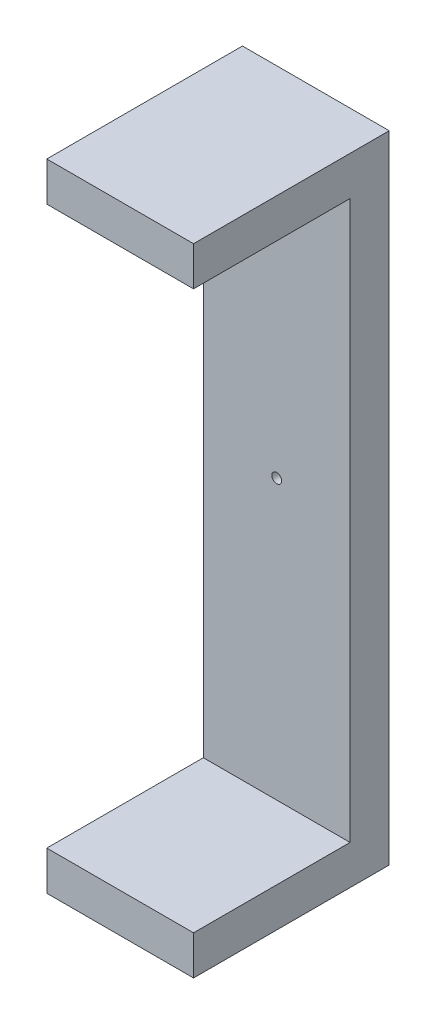
ISO-10303-21;
HEADER;
FILE_DESCRIPTION(('STEP AP214'),'2;1');
FILE_NAME('part.step','',(''),(''),'','','');
FILE_SCHEMA(('AUTOMOTIVE_DESIGN { 1 0 10303 214 1 1 1 1 }'));
ENDSEC;
DATA;
#1=APPLICATION_CONTEXT('core data for automotive mechanical design processes');
#2=APPLICATION_PROTOCOL_DEFINITION('international standard','automotive_design',2000,#1);
#3=PRODUCT_CONTEXT('',#1,'mechanical');
#4=PRODUCT('Part','Part','',(#3));
#5=PRODUCT_RELATED_PRODUCT_CATEGORY('part','',(#4));
#6=PRODUCT_DEFINITION_FORMATION('','',#4);
#7=PRODUCT_DEFINITION_CONTEXT('part definition',#1,'design');
#8=PRODUCT_DEFINITION('design','',#6,#7);
#9=PRODUCT_DEFINITION_SHAPE('','',#8);
#10=(LENGTH_UNIT() NAMED_UNIT(*) SI_UNIT(.MILLI.,.METRE.));
#11=(NAMED_UNIT(*) PLANE_ANGLE_UNIT() SI_UNIT($,.RADIAN.));
#12=(NAMED_UNIT(*) SI_UNIT($,.STERADIAN.) SOLID_ANGLE_UNIT());
#13=UNCERTAINTY_MEASURE_WITH_UNIT(LENGTH_MEASURE(1.E-05),#10,'distance_accuracy_value','');
#14=(GEOMETRIC_REPRESENTATION_CONTEXT(3) GLOBAL_UNCERTAINTY_ASSIGNED_CONTEXT((#13)) GLOBAL_UNIT_ASSIGNED_CONTEXT((#10,
#11,#12)) REPRESENTATION_CONTEXT('',''));
#15=CARTESIAN_POINT('',(0.,0.,0.));
#16=DIRECTION('',(0.,0.,1.));
#17=DIRECTION('',(1.,0.,0.));
#18=AXIS2_PLACEMENT_3D('',#15,#16,#17);
#19=CARTESIAN_POINT('',(0.,0.,20.));
#20=DIRECTION('',(0.,0.,1.));
#21=DIRECTION('',(1.,0.,0.));
#22=AXIS2_PLACEMENT_3D('',#19,#20,#21);
#23=PLANE('',#22);
#24=DIRECTION('',(0.,1.,0.));
#25=VECTOR('',#24,1.);
#26=CARTESIAN_POINT('',(15.,0.,20.));
#27=LINE('',#26,#25);
#28=CARTESIAN_POINT('',(15.,0.,20.));
#29=VERTEX_POINT('',#28);
#30=CARTESIAN_POINT('',(15.,-4.,20.));
#31=VERTEX_POINT('',#30);
#32=EDGE_CURVE('E94',#29,#31,#27,.F.);
#33=ORIENTED_EDGE('',*,*,#32,.F.);
#34=DIRECTION('',(1.,0.,0.));
#35=VECTOR('',#34,1.);
#36=CARTESIAN_POINT('',(0.,0.,20.));
#37=LINE('',#36,#35);
#38=CARTESIAN_POINT('',(0.,0.,20.));
#39=VERTEX_POINT('',#38);
#40=EDGE_CURVE('E84',#39,#29,#37,.T.);
#41=ORIENTED_EDGE('',*,*,#40,.F.);
#42=DIRECTION('',(0.,1.,0.));
#43=VECTOR('',#42,1.);
#44=CARTESIAN_POINT('',(0.,0.,20.));
#45=LINE('',#44,#43);
#46=CARTESIAN_POINT('',(0.,-4.,20.));
#47=VERTEX_POINT('',#46);
#48=EDGE_CURVE('E131',#39,#47,#45,.F.);
#49=ORIENTED_EDGE('',*,*,#48,.T.);
#50=DIRECTION('',(1.,0.,0.));
#51=VECTOR('',#50,1.);
#52=CARTESIAN_POINT('',(0.,-4.,20.));
#53=LINE('',#52,#51);
#54=EDGE_CURVE('E79',#47,#31,#53,.T.);
#55=ORIENTED_EDGE('',*,*,#54,.T.);
#56=EDGE_LOOP('',(#33,#41,#49,#55));
#57=FACE_BOUND('',#56,.T.);
#58=ADVANCED_FACE('F16',(#57),#23,.T.);
#59=CARTESIAN_POINT('',(0.,-4.,20.));
#60=DIRECTION('',(0.,1.,0.));
#61=DIRECTION('',(0.,0.,1.));
#62=AXIS2_PLACEMENT_3D('',#59,#60,#61);
#63=PLANE('',#62);
#64=DIRECTION('',(0.,0.,1.));
#65=VECTOR('',#64,1.);
#66=CARTESIAN_POINT('',(15.,-4.,4.));
#67=LINE('',#66,#65);
#68=CARTESIAN_POINT('',(15.,-4.,4.));
#69=VERTEX_POINT('',#68);
#70=EDGE_CURVE('E97',#31,#69,#67,.F.);
#71=ORIENTED_EDGE('',*,*,#70,.F.);
#72=ORIENTED_EDGE('',*,*,#54,.F.);
#73=DIRECTION('',(0.,0.,1.));
#74=VECTOR('',#73,1.);
#75=CARTESIAN_POINT('',(0.,-4.,4.));
#76=LINE('',#75,#74);
#77=CARTESIAN_POINT('',(0.,-4.,4.));
#78=VERTEX_POINT('',#77);
#79=EDGE_CURVE('E129',#47,#78,#76,.F.);
#80=ORIENTED_EDGE('',*,*,#79,.T.);
#81=DIRECTION('',(-1.,0.,0.));
#82=VECTOR('',#81,1.);
#83=CARTESIAN_POINT('',(0.,-4.,4.));
#84=LINE('',#83,#82);
#85=EDGE_CURVE('E112',#78,#69,#84,.F.);
#86=ORIENTED_EDGE('',*,*,#85,.T.);
#87=EDGE_LOOP('',(#71,#72,#80,#86));
#88=FACE_BOUND('',#87,.T.);
#89=ADVANCED_FACE('F147',(#88),#63,.F.);
#90=CARTESIAN_POINT('',(0.,0.,4.));
#91=DIRECTION('',(0.,0.,-1.));
#92=DIRECTION('',(-1.,0.,0.));
#93=AXIS2_PLACEMENT_3D('',#90,#91,#92);
#94=PLANE('',#93);
#95=DIRECTION('',(0.,1.,0.));
#96=VECTOR('',#95,1.);
#97=CARTESIAN_POINT('',(15.,0.,4.));
#98=LINE('',#97,#96);
#99=CARTESIAN_POINT('',(15.,-61.,4.));
#100=VERTEX_POINT('',#99);
#101=EDGE_CURVE('E143',#69,#100,#98,.F.);
#102=ORIENTED_EDGE('',*,*,#101,.F.);
#103=ORIENTED_EDGE('',*,*,#85,.F.);
#104=DIRECTION('',(0.,1.,0.));
#105=VECTOR('',#104,1.);
#106=CARTESIAN_POINT('',(0.,0.,4.));
#107=LINE('',#106,#105);
#108=CARTESIAN_POINT('',(0.,-61.,4.));
#109=VERTEX_POINT('',#108);
#110=EDGE_CURVE('E127',#78,#109,#107,.F.);
#111=ORIENTED_EDGE('',*,*,#110,.T.);
#112=DIRECTION('',(1.,0.,0.));
#113=VECTOR('',#112,1.);
#114=CARTESIAN_POINT('',(0.,-61.,4.));
#115=LINE('',#114,#113);
#116=EDGE_CURVE('E110',#109,#100,#115,.T.);
#117=ORIENTED_EDGE('',*,*,#116,.T.);
#118=EDGE_LOOP('',(#102,#103,#111,#117));
#119=FACE_BOUND('',#118,.T.);
#120=CARTESIAN_POINT('',(7.5,-32.5,4.));
#121=DIRECTION('',(0.,0.,-1.));
#122=DIRECTION('',(-1.,0.,0.));
#123=AXIS2_PLACEMENT_3D('',#120,#121,#122);
#124=CIRCLE('',#123,0.5);
#125=CARTESIAN_POINT('',(7.,-32.5,4.));
#126=VERTEX_POINT('',#125);
#127=EDGE_CURVE('E19',#126,#126,#124,.T.);
#128=ORIENTED_EDGE('',*,*,#127,.T.);
#129=EDGE_LOOP('',(#128));
#130=FACE_BOUND('',#129,.T.);
#131=ADVANCED_FACE('F152',(#119,#130),#94,.F.);
#132=CARTESIAN_POINT('',(0.,-61.,20.));
#133=DIRECTION('',(0.,-1.,0.));
#134=DIRECTION('',(0.,0.,-1.));
#135=AXIS2_PLACEMENT_3D('',#132,#133,#134);
#136=PLANE('',#135);
#137=DIRECTION('',(0.,0.,1.));
#138=VECTOR('',#137,1.);
#139=CARTESIAN_POINT('',(0.,-61.,4.));
#140=LINE('',#139,#138);
#141=CARTESIAN_POINT('',(0.,-61.,20.));
#142=VERTEX_POINT('',#141);
#143=EDGE_CURVE('E122',#109,#142,#140,.T.);
#144=ORIENTED_EDGE('',*,*,#143,.T.);
#145=DIRECTION('',(1.,0.,0.));
#146=VECTOR('',#145,1.);
#147=CARTESIAN_POINT('',(0.,-61.,20.));
#148=LINE('',#147,#146);
#149=CARTESIAN_POINT('',(15.,-61.,20.));
#150=VERTEX_POINT('',#149);
#151=EDGE_CURVE('E107',#150,#142,#148,.F.);
#152=ORIENTED_EDGE('',*,*,#151,.F.);
#153=DIRECTION('',(0.,0.,1.));
#154=VECTOR('',#153,1.);
#155=CARTESIAN_POINT('',(15.,-61.,4.));
#156=LINE('',#155,#154);
#157=EDGE_CURVE('E140',#100,#150,#156,.T.);
#158=ORIENTED_EDGE('',*,*,#157,.F.);
#159=ORIENTED_EDGE('',*,*,#116,.F.);
#160=EDGE_LOOP('',(#144,#152,#158,#159));
#161=FACE_BOUND('',#160,.T.);
#162=ADVANCED_FACE('F158',(#161),#136,.F.);
#163=CARTESIAN_POINT('',(0.,0.,20.));
#164=DIRECTION('',(0.,0.,1.));
#165=DIRECTION('',(1.,0.,0.));
#166=AXIS2_PLACEMENT_3D('',#163,#164,#165);
#167=PLANE('',#166);
#168=DIRECTION('',(0.,1.,0.));
#169=VECTOR('',#168,1.);
#170=CARTESIAN_POINT('',(15.,0.,20.));
#171=LINE('',#170,#169);
#172=CARTESIAN_POINT('',(15.,-65.,20.));
#173=VERTEX_POINT('',#172);
#174=EDGE_CURVE('E138',#150,#173,#171,.F.);
#175=ORIENTED_EDGE('',*,*,#174,.F.);
#176=ORIENTED_EDGE('',*,*,#151,.T.);
#177=DIRECTION('',(0.,1.,0.));
#178=VECTOR('',#177,1.);
#179=CARTESIAN_POINT('',(0.,0.,20.));
#180=LINE('',#179,#178);
#181=CARTESIAN_POINT('',(0.,-65.,20.));
#182=VERTEX_POINT('',#181);
#183=EDGE_CURVE('E120',#142,#182,#180,.F.);
#184=ORIENTED_EDGE('',*,*,#183,.T.);
#185=DIRECTION('',(1.,0.,0.));
#186=VECTOR('',#185,1.);
#187=CARTESIAN_POINT('',(0.,-65.,20.));
#188=LINE('',#187,#186);
#189=EDGE_CURVE('E136',#182,#173,#188,.T.);
#190=ORIENTED_EDGE('',*,*,#189,.T.);
#191=EDGE_LOOP('',(#175,#176,#184,#190));
#192=FACE_BOUND('',#191,.T.);
#193=ADVANCED_FACE('F170',(#192),#167,.T.);
#194=CARTESIAN_POINT('',(7.5,-32.5,16.));
#195=DIRECTION('',(0.,0.,-1.));
#196=DIRECTION('',(-1.,0.,0.));
#197=AXIS2_PLACEMENT_3D('',#194,#195,#196);
#198=CYLINDRICAL_SURFACE('',#197,0.5);
#199=CARTESIAN_POINT('',(7.5,-32.5,0.));
#200=DIRECTION('',(0.,0.,-1.));
#201=DIRECTION('',(-1.,0.,0.));
#202=AXIS2_PLACEMENT_3D('',#199,#200,#201);
#203=CIRCLE('',#202,0.5);
#204=CARTESIAN_POINT('',(7.,-32.5,0.));
#205=VERTEX_POINT('',#204);
#206=EDGE_CURVE('E114',#205,#205,#203,.F.);
#207=ORIENTED_EDGE('',*,*,#206,.F.);
#208=EDGE_LOOP('',(#207));
#209=FACE_BOUND('',#208,.T.);
#210=ORIENTED_EDGE('',*,*,#127,.F.);
#211=EDGE_LOOP('',(#210));
#212=FACE_BOUND('',#211,.T.);
#213=ADVANCED_FACE('F172',(#209,#212),#198,.F.);
#214=CARTESIAN_POINT('',(0.,0.,4.));
#215=DIRECTION('',(0.,1.,0.));
#216=DIRECTION('',(0.,0.,1.));
#217=AXIS2_PLACEMENT_3D('',#214,#215,#216);
#218=PLANE('',#217);
#219=ORIENTED_EDGE('',*,*,#40,.T.);
#220=DIRECTION('',(0.,0.,1.));
#221=VECTOR('',#220,1.);
#222=CARTESIAN_POINT('',(15.,0.,4.));
#223=LINE('',#222,#221);
#224=CARTESIAN_POINT('',(15.,0.,0.));
#225=VERTEX_POINT('',#224);
#226=EDGE_CURVE('E87',#225,#29,#223,.T.);
#227=ORIENTED_EDGE('',*,*,#226,.F.);
#228=DIRECTION('',(-1.,0.,0.));
#229=VECTOR('',#228,1.);
#230=CARTESIAN_POINT('',(0.,0.,0.));
#231=LINE('',#230,#229);
#232=CARTESIAN_POINT('',(0.,0.,0.));
#233=VERTEX_POINT('',#232);
#234=EDGE_CURVE('E116',#233,#225,#231,.F.);
#235=ORIENTED_EDGE('',*,*,#234,.F.);
#236=DIRECTION('',(0.,0.,1.));
#237=VECTOR('',#236,1.);
#238=CARTESIAN_POINT('',(0.,0.,4.));
#239=LINE('',#238,#237);
#240=EDGE_CURVE('E90',#233,#39,#239,.T.);
#241=ORIENTED_EDGE('',*,*,#240,.T.);
#242=EDGE_LOOP('',(#219,#227,#235,#241));
#243=FACE_BOUND('',#242,.T.);
#244=ADVANCED_FACE('F85',(#243),#218,.T.);
#245=CARTESIAN_POINT('',(15.,0.,4.));
#246=DIRECTION('',(1.,0.,0.));
#247=DIRECTION('',(0.,1.,0.));
#248=AXIS2_PLACEMENT_3D('',#245,#246,#247);
#249=PLANE('',#248);
#250=ORIENTED_EDGE('',*,*,#174,.T.);
#251=DIRECTION('',(0.,0.,1.));
#252=VECTOR('',#251,1.);
#253=CARTESIAN_POINT('',(15.,-65.,4.));
#254=LINE('',#253,#252);
#255=CARTESIAN_POINT('',(15.,-65.,0.));
#256=VERTEX_POINT('',#255);
#257=EDGE_CURVE('E134',#173,#256,#254,.F.);
#258=ORIENTED_EDGE('',*,*,#257,.T.);
#259=DIRECTION('',(0.,1.,0.));
#260=VECTOR('',#259,1.);
#261=CARTESIAN_POINT('',(15.,0.,0.));
#262=LINE('',#261,#260);
#263=EDGE_CURVE('E102',#225,#256,#262,.F.);
#264=ORIENTED_EDGE('',*,*,#263,.F.);
#265=ORIENTED_EDGE('',*,*,#226,.T.);
#266=ORIENTED_EDGE('',*,*,#32,.T.);
#267=ORIENTED_EDGE('',*,*,#70,.T.);
#268=ORIENTED_EDGE('',*,*,#101,.T.);
#269=ORIENTED_EDGE('',*,*,#157,.T.);
#270=EDGE_LOOP('',(#250,#258,#264,#265,#266,#267,#268,#269));
#271=FACE_BOUND('',#270,.T.);
#272=ADVANCED_FACE('F100',(#271),#249,.T.);
#273=CARTESIAN_POINT('',(0.,-65.,4.));
#274=DIRECTION('',(0.,1.,0.));
#275=DIRECTION('',(0.,0.,1.));
#276=AXIS2_PLACEMENT_3D('',#273,#274,#275);
#277=PLANE('',#276);
#278=ORIENTED_EDGE('',*,*,#257,.F.);
#279=ORIENTED_EDGE('',*,*,#189,.F.);
#280=DIRECTION('',(0.,0.,1.));
#281=VECTOR('',#280,1.);
#282=CARTESIAN_POINT('',(0.,-65.,4.));
#283=LINE('',#282,#281);
#284=CARTESIAN_POINT('',(0.,-65.,0.));
#285=VERTEX_POINT('',#284);
#286=EDGE_CURVE('E34',#182,#285,#283,.F.);
#287=ORIENTED_EDGE('',*,*,#286,.T.);
#288=DIRECTION('',(-1.,0.,0.));
#289=VECTOR('',#288,1.);
#290=CARTESIAN_POINT('',(0.,-65.,0.));
#291=LINE('',#290,#289);
#292=EDGE_CURVE('E25',#256,#285,#291,.T.);
#293=ORIENTED_EDGE('',*,*,#292,.F.);
#294=EDGE_LOOP('',(#278,#279,#287,#293));
#295=FACE_BOUND('',#294,.T.);
#296=ADVANCED_FACE('F162',(#295),#277,.F.);
#297=CARTESIAN_POINT('',(0.,0.,4.));
#298=DIRECTION('',(1.,0.,0.));
#299=DIRECTION('',(0.,1.,0.));
#300=AXIS2_PLACEMENT_3D('',#297,#298,#299);
#301=PLANE('',#300);
#302=ORIENTED_EDGE('',*,*,#286,.F.);
#303=ORIENTED_EDGE('',*,*,#183,.F.);
#304=ORIENTED_EDGE('',*,*,#143,.F.);
#305=ORIENTED_EDGE('',*,*,#110,.F.);
#306=ORIENTED_EDGE('',*,*,#79,.F.);
#307=ORIENTED_EDGE('',*,*,#48,.F.);
#308=ORIENTED_EDGE('',*,*,#240,.F.);
#309=DIRECTION('',(0.,1.,0.));
#310=VECTOR('',#309,1.);
#311=CARTESIAN_POINT('',(0.,0.,0.));
#312=LINE('',#311,#310);
#313=EDGE_CURVE('E9',#285,#233,#312,.T.);
#314=ORIENTED_EDGE('',*,*,#313,.F.);
#315=EDGE_LOOP('',(#302,#303,#304,#305,#306,#307,#308,#314));
#316=FACE_BOUND('',#315,.T.);
#317=ADVANCED_FACE('F168',(#316),#301,.F.);
#318=CARTESIAN_POINT('',(0.,0.,0.));
#319=DIRECTION('',(0.,0.,-1.));
#320=DIRECTION('',(-1.,0.,0.));
#321=AXIS2_PLACEMENT_3D('',#318,#319,#320);
#322=PLANE('',#321);
#323=ORIENTED_EDGE('',*,*,#292,.T.);
#324=ORIENTED_EDGE('',*,*,#313,.T.);
#325=ORIENTED_EDGE('',*,*,#234,.T.);
#326=ORIENTED_EDGE('',*,*,#263,.T.);
#327=EDGE_LOOP('',(#323,#324,#325,#326));
#328=FACE_BOUND('',#327,.T.);
#329=ORIENTED_EDGE('',*,*,#206,.T.);
#330=EDGE_LOOP('',(#329));
#331=FACE_BOUND('',#330,.T.);
#332=ADVANCED_FACE('F166',(#328,#331),#322,.T.);
#333=CLOSED_SHELL('',(#58,#89,#131,#162,#193,#213,#244,#272,#296,#317,#332));
#334=MANIFOLD_SOLID_BREP('B1',#333);
#335=ADVANCED_BREP_SHAPE_REPRESENTATION('',(#18,#334),#14);
#336=SHAPE_DEFINITION_REPRESENTATION(#9,#335);
ENDSEC;
END-ISO-10303-21;
